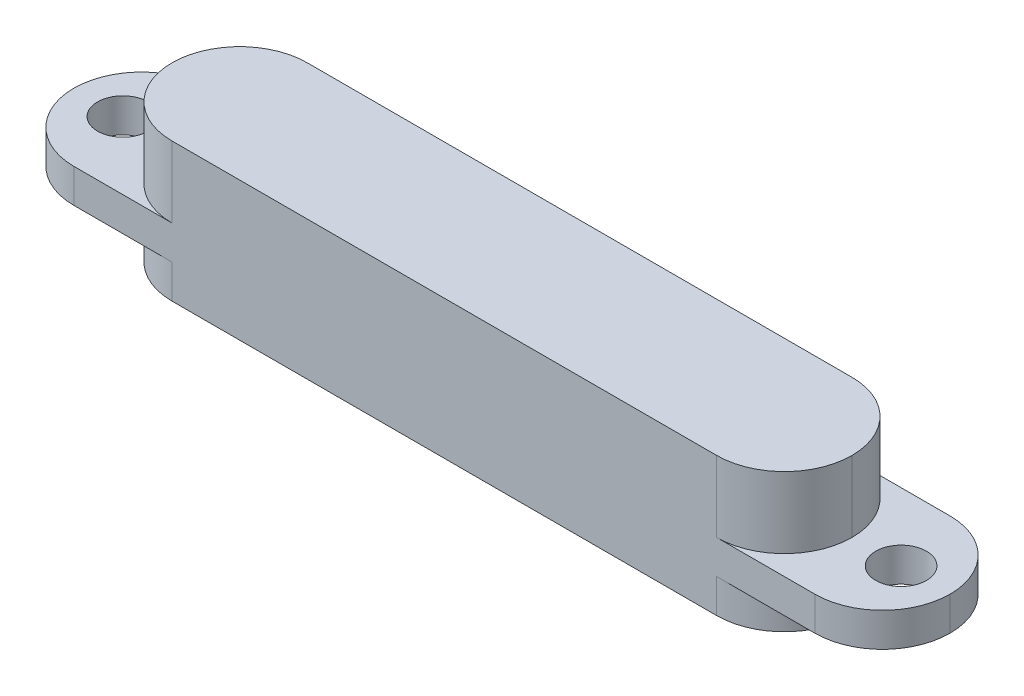
ISO-10303-21;
HEADER;
FILE_DESCRIPTION(('STEP AP214'),'2;1');
FILE_NAME('part.step','',(''),(''),'','','');
FILE_SCHEMA(('AUTOMOTIVE_DESIGN { 1 0 10303 214 1 1 1 1 }'));
ENDSEC;
DATA;
#1=APPLICATION_CONTEXT('core data for automotive mechanical design processes');
#2=APPLICATION_PROTOCOL_DEFINITION('international standard','automotive_design',2000,#1);
#3=PRODUCT_CONTEXT('',#1,'mechanical');
#4=PRODUCT('Part','Part','',(#3));
#5=PRODUCT_RELATED_PRODUCT_CATEGORY('part','',(#4));
#6=PRODUCT_DEFINITION_FORMATION('','',#4);
#7=PRODUCT_DEFINITION_CONTEXT('part definition',#1,'design');
#8=PRODUCT_DEFINITION('design','',#6,#7);
#9=PRODUCT_DEFINITION_SHAPE('','',#8);
#10=(LENGTH_UNIT() NAMED_UNIT(*) SI_UNIT(.MILLI.,.METRE.));
#11=(NAMED_UNIT(*) PLANE_ANGLE_UNIT() SI_UNIT($,.RADIAN.));
#12=(NAMED_UNIT(*) SI_UNIT($,.STERADIAN.) SOLID_ANGLE_UNIT());
#13=UNCERTAINTY_MEASURE_WITH_UNIT(LENGTH_MEASURE(1.E-05),#10,'distance_accuracy_value','');
#14=(GEOMETRIC_REPRESENTATION_CONTEXT(3) GLOBAL_UNCERTAINTY_ASSIGNED_CONTEXT((#13)) GLOBAL_UNIT_ASSIGNED_CONTEXT((#10,
#11,#12)) REPRESENTATION_CONTEXT('',''));
#15=CARTESIAN_POINT('',(0.,0.,0.));
#16=DIRECTION('',(0.,0.,1.));
#17=DIRECTION('',(1.,0.,0.));
#18=AXIS2_PLACEMENT_3D('',#15,#16,#17);
#19=CARTESIAN_POINT('',(0.,-1.,0.));
#20=DIRECTION('',(0.,1.,0.));
#21=DIRECTION('',(0.,0.,1.));
#22=AXIS2_PLACEMENT_3D('',#19,#20,#21);
#23=PLANE('',#22);
#24=CARTESIAN_POINT('',(-11.5,-1.,0.));
#25=DIRECTION('',(0.,-1.,0.));
#26=DIRECTION('',(0.,0.,-1.));
#27=AXIS2_PLACEMENT_3D('',#24,#25,#26);
#28=CIRCLE('',#27,0.75);
#29=CARTESIAN_POINT('',(-11.5,-1.,-0.75));
#30=VERTEX_POINT('',#29);
#31=EDGE_CURVE('E289',#30,#30,#28,.T.);
#32=ORIENTED_EDGE('',*,*,#31,.F.);
#33=EDGE_LOOP('',(#32));
#34=FACE_BOUND('',#33,.T.);
#35=DIRECTION('',(1.,0.,0.));
#36=VECTOR('',#35,1.);
#37=CARTESIAN_POINT('',(-12.95,-1.,2.));
#38=LINE('',#37,#36);
#39=CARTESIAN_POINT('',(-10.95,-1.,2.));
#40=VERTEX_POINT('',#39);
#41=CARTESIAN_POINT('',(-8.05,-1.,2.));
#42=VERTEX_POINT('',#41);
#43=EDGE_CURVE('E343',#40,#42,#38,.T.);
#44=ORIENTED_EDGE('',*,*,#43,.F.);
#45=CARTESIAN_POINT('',(-10.95,-1.,0.));
#46=DIRECTION('',(0.,1.,0.));
#47=DIRECTION('',(0.,0.,1.));
#48=AXIS2_PLACEMENT_3D('',#45,#46,#47);
#49=CIRCLE('',#48,2.);
#50=CARTESIAN_POINT('',(-12.95,-1.,0.));
#51=VERTEX_POINT('',#50);
#52=EDGE_CURVE('E190',#40,#51,#49,.F.);
#53=ORIENTED_EDGE('',*,*,#52,.T.);
#54=CARTESIAN_POINT('',(-10.95,-1.,0.));
#55=DIRECTION('',(0.,1.,0.));
#56=DIRECTION('',(0.,0.,1.));
#57=AXIS2_PLACEMENT_3D('',#54,#55,#56);
#58=CIRCLE('',#57,2.);
#59=CARTESIAN_POINT('',(-10.95,-1.,-2.));
#60=VERTEX_POINT('',#59);
#61=EDGE_CURVE('E175',#51,#60,#58,.F.);
#62=ORIENTED_EDGE('',*,*,#61,.T.);
#63=DIRECTION('',(1.,0.,0.));
#64=VECTOR('',#63,1.);
#65=CARTESIAN_POINT('',(-12.95,-1.,-2.));
#66=LINE('',#65,#64);
#67=CARTESIAN_POINT('',(-8.05,-1.,-2.));
#68=VERTEX_POINT('',#67);
#69=EDGE_CURVE('E334',#60,#68,#66,.T.);
#70=ORIENTED_EDGE('',*,*,#69,.T.);
#71=CARTESIAN_POINT('',(-8.05,-1.,0.));
#72=DIRECTION('',(0.,1.,0.));
#73=DIRECTION('',(0.,0.,1.));
#74=AXIS2_PLACEMENT_3D('',#71,#72,#73);
#75=CIRCLE('',#74,2.);
#76=CARTESIAN_POINT('',(-10.05,-1.,0.));
#77=VERTEX_POINT('',#76);
#78=EDGE_CURVE('E257',#68,#77,#75,.T.);
#79=ORIENTED_EDGE('',*,*,#78,.T.);
#80=CARTESIAN_POINT('',(-8.05,-1.,0.));
#81=DIRECTION('',(0.,1.,0.));
#82=DIRECTION('',(0.,0.,1.));
#83=AXIS2_PLACEMENT_3D('',#80,#81,#82);
#84=CIRCLE('',#83,2.);
#85=EDGE_CURVE('E259',#77,#42,#84,.T.);
#86=ORIENTED_EDGE('',*,*,#85,.T.);
#87=EDGE_LOOP('',(#44,#53,#62,#70,#79,#86));
#88=FACE_BOUND('',#87,.T.);
#89=ADVANCED_FACE('F39',(#34,#88),#23,.F.);
#90=CARTESIAN_POINT('',(-10.05,2.1,2.));
#91=DIRECTION('',(0.,0.,-1.));
#92=DIRECTION('',(-1.,0.,0.));
#93=AXIS2_PLACEMENT_3D('',#90,#91,#92);
#94=PLANE('',#93);
#95=ORIENTED_EDGE('',*,*,#43,.T.);
#96=DIRECTION('',(0.,1.,0.));
#97=VECTOR('',#96,1.);
#98=CARTESIAN_POINT('',(-8.05,2.1,2.));
#99=LINE('',#98,#97);
#100=CARTESIAN_POINT('',(-8.05,-2.,2.));
#101=VERTEX_POINT('',#100);
#102=EDGE_CURVE('E247',#42,#101,#99,.F.);
#103=ORIENTED_EDGE('',*,*,#102,.T.);
#104=DIRECTION('',(1.,0.,0.));
#105=VECTOR('',#104,1.);
#106=CARTESIAN_POINT('',(0.,-2.,2.));
#107=LINE('',#106,#105);
#108=CARTESIAN_POINT('',(8.05,-2.,2.));
#109=VERTEX_POINT('',#108);
#110=EDGE_CURVE('E322',#101,#109,#107,.T.);
#111=ORIENTED_EDGE('',*,*,#110,.T.);
#112=DIRECTION('',(0.,1.,0.));
#113=VECTOR('',#112,1.);
#114=CARTESIAN_POINT('',(8.05,-1.,2.));
#115=LINE('',#114,#113);
#116=CARTESIAN_POINT('',(8.04999999999999,-1.,2.));
#117=VERTEX_POINT('',#116);
#118=EDGE_CURVE('E244',#109,#117,#115,.T.);
#119=ORIENTED_EDGE('',*,*,#118,.T.);
#120=CARTESIAN_POINT('',(10.95,-1.,2.));
#121=VERTEX_POINT('',#120);
#122=EDGE_CURVE('E346',#117,#121,#38,.T.);
#123=ORIENTED_EDGE('',*,*,#122,.T.);
#124=DIRECTION('',(0.,1.,0.));
#125=VECTOR('',#124,1.);
#126=CARTESIAN_POINT('',(10.95,0.,2.));
#127=LINE('',#126,#125);
#128=CARTESIAN_POINT('',(10.95,0.,2.));
#129=VERTEX_POINT('',#128);
#130=EDGE_CURVE('E191',#121,#129,#127,.T.);
#131=ORIENTED_EDGE('',*,*,#130,.T.);
#132=DIRECTION('',(1.,0.,0.));
#133=VECTOR('',#132,1.);
#134=CARTESIAN_POINT('',(-12.95,0.,2.));
#135=LINE('',#134,#133);
#136=CARTESIAN_POINT('',(8.05,0.,2.));
#137=VERTEX_POINT('',#136);
#138=EDGE_CURVE('E187',#137,#129,#135,.T.);
#139=ORIENTED_EDGE('',*,*,#138,.F.);
#140=DIRECTION('',(0.,-1.,0.));
#141=VECTOR('',#140,1.);
#142=CARTESIAN_POINT('',(8.05,2.1,2.));
#143=LINE('',#142,#141);
#144=CARTESIAN_POINT('',(8.05,2.1,2.));
#145=VERTEX_POINT('',#144);
#146=EDGE_CURVE('E242',#137,#145,#143,.F.);
#147=ORIENTED_EDGE('',*,*,#146,.T.);
#148=DIRECTION('',(1.,0.,0.));
#149=VECTOR('',#148,1.);
#150=CARTESIAN_POINT('',(-10.05,2.1,2.));
#151=LINE('',#150,#149);
#152=CARTESIAN_POINT('',(-8.05,2.1,2.));
#153=VERTEX_POINT('',#152);
#154=EDGE_CURVE('E198',#153,#145,#151,.T.);
#155=ORIENTED_EDGE('',*,*,#154,.F.);
#156=DIRECTION('',(0.,-1.,0.));
#157=VECTOR('',#156,1.);
#158=CARTESIAN_POINT('',(-8.05,0.,2.));
#159=LINE('',#158,#157);
#160=CARTESIAN_POINT('',(-8.05,0.,2.));
#161=VERTEX_POINT('',#160);
#162=EDGE_CURVE('E185',#153,#161,#159,.T.);
#163=ORIENTED_EDGE('',*,*,#162,.T.);
#164=CARTESIAN_POINT('',(-10.95,0.,2.));
#165=VERTEX_POINT('',#164);
#166=EDGE_CURVE('E167',#165,#161,#135,.T.);
#167=ORIENTED_EDGE('',*,*,#166,.F.);
#168=DIRECTION('',(0.,1.,0.));
#169=VECTOR('',#168,1.);
#170=CARTESIAN_POINT('',(-10.95,2.1,2.));
#171=LINE('',#170,#169);
#172=EDGE_CURVE('E181',#165,#40,#171,.F.);
#173=ORIENTED_EDGE('',*,*,#172,.T.);
#174=EDGE_LOOP('',(#95,#103,#111,#119,#123,#131,#139,#147,#155,#163,#167,#173));
#175=FACE_BOUND('',#174,.T.);
#176=ADVANCED_FACE('F180',(#175),#94,.F.);
#177=CARTESIAN_POINT('',(-10.05,2.1,-2.));
#178=DIRECTION('',(0.,0.,-1.));
#179=DIRECTION('',(-1.,0.,0.));
#180=AXIS2_PLACEMENT_3D('',#177,#178,#179);
#181=PLANE('',#180);
#182=DIRECTION('',(1.,0.,0.));
#183=VECTOR('',#182,1.);
#184=CARTESIAN_POINT('',(0.,-2.,-2.));
#185=LINE('',#184,#183);
#186=CARTESIAN_POINT('',(-8.05,-2.,-2.));
#187=VERTEX_POINT('',#186);
#188=CARTESIAN_POINT('',(8.05,-2.,-2.));
#189=VERTEX_POINT('',#188);
#190=EDGE_CURVE('E220',#187,#189,#185,.T.);
#191=ORIENTED_EDGE('',*,*,#190,.F.);
#192=DIRECTION('',(0.,1.,0.));
#193=VECTOR('',#192,1.);
#194=CARTESIAN_POINT('',(-8.05,-1.,-2.));
#195=LINE('',#194,#193);
#196=EDGE_CURVE('E230',#187,#68,#195,.T.);
#197=ORIENTED_EDGE('',*,*,#196,.T.);
#198=ORIENTED_EDGE('',*,*,#69,.F.);
#199=DIRECTION('',(0.,1.,0.));
#200=VECTOR('',#199,1.);
#201=CARTESIAN_POINT('',(-10.95,0.,-2.));
#202=LINE('',#201,#200);
#203=CARTESIAN_POINT('',(-10.95,0.,-2.));
#204=VERTEX_POINT('',#203);
#205=EDGE_CURVE('E209',#60,#204,#202,.T.);
#206=ORIENTED_EDGE('',*,*,#205,.T.);
#207=DIRECTION('',(1.,0.,0.));
#208=VECTOR('',#207,1.);
#209=CARTESIAN_POINT('',(-12.95,0.,-2.));
#210=LINE('',#209,#208);
#211=CARTESIAN_POINT('',(-8.05,0.,-2.));
#212=VERTEX_POINT('',#211);
#213=EDGE_CURVE('E348',#204,#212,#210,.T.);
#214=ORIENTED_EDGE('',*,*,#213,.T.);
#215=DIRECTION('',(0.,-1.,0.));
#216=VECTOR('',#215,1.);
#217=CARTESIAN_POINT('',(-8.05,2.1,-2.));
#218=LINE('',#217,#216);
#219=CARTESIAN_POINT('',(-8.05,2.1,-2.));
#220=VERTEX_POINT('',#219);
#221=EDGE_CURVE('E216',#212,#220,#218,.F.);
#222=ORIENTED_EDGE('',*,*,#221,.T.);
#223=DIRECTION('',(1.,0.,0.));
#224=VECTOR('',#223,1.);
#225=CARTESIAN_POINT('',(-10.05,2.1,-2.));
#226=LINE('',#225,#224);
#227=CARTESIAN_POINT('',(8.05,2.1,-2.));
#228=VERTEX_POINT('',#227);
#229=EDGE_CURVE('E192',#220,#228,#226,.T.);
#230=ORIENTED_EDGE('',*,*,#229,.T.);
#231=DIRECTION('',(0.,-1.,0.));
#232=VECTOR('',#231,1.);
#233=CARTESIAN_POINT('',(8.05,0.,-2.));
#234=LINE('',#233,#232);
#235=CARTESIAN_POINT('',(8.04999999999999,0.,-2.));
#236=VERTEX_POINT('',#235);
#237=EDGE_CURVE('E225',#228,#236,#234,.T.);
#238=ORIENTED_EDGE('',*,*,#237,.T.);
#239=CARTESIAN_POINT('',(10.95,0.,-2.));
#240=VERTEX_POINT('',#239);
#241=EDGE_CURVE('E186',#236,#240,#210,.T.);
#242=ORIENTED_EDGE('',*,*,#241,.T.);
#243=DIRECTION('',(0.,1.,0.));
#244=VECTOR('',#243,1.);
#245=CARTESIAN_POINT('',(10.95,2.1,-2.));
#246=LINE('',#245,#244);
#247=CARTESIAN_POINT('',(10.95,-1.,-2.));
#248=VERTEX_POINT('',#247);
#249=EDGE_CURVE('E211',#240,#248,#246,.F.);
#250=ORIENTED_EDGE('',*,*,#249,.T.);
#251=CARTESIAN_POINT('',(8.05,-1.,-2.));
#252=VERTEX_POINT('',#251);
#253=EDGE_CURVE('E345',#252,#248,#66,.T.);
#254=ORIENTED_EDGE('',*,*,#253,.F.);
#255=DIRECTION('',(0.,1.,0.));
#256=VECTOR('',#255,1.);
#257=CARTESIAN_POINT('',(8.05,2.1,-2.));
#258=LINE('',#257,#256);
#259=EDGE_CURVE('E228',#252,#189,#258,.F.);
#260=ORIENTED_EDGE('',*,*,#259,.T.);
#261=EDGE_LOOP('',(#191,#197,#198,#206,#214,#222,#230,#238,#242,#250,#254,#260));
#262=FACE_BOUND('',#261,.T.);
#263=ADVANCED_FACE('F333',(#262),#181,.T.);
#264=CARTESIAN_POINT('',(0.,2.1,0.));
#265=DIRECTION('',(0.,1.,0.));
#266=DIRECTION('',(0.,0.,1.));
#267=AXIS2_PLACEMENT_3D('',#264,#265,#266);
#268=PLANE('',#267);
#269=CARTESIAN_POINT('',(8.05,2.1,0.));
#270=DIRECTION('',(0.,1.,0.));
#271=DIRECTION('',(0.,0.,1.));
#272=AXIS2_PLACEMENT_3D('',#269,#270,#271);
#273=CIRCLE('',#272,2.);
#274=CARTESIAN_POINT('',(10.05,2.1,0.));
#275=VERTEX_POINT('',#274);
#276=EDGE_CURVE('E253',#145,#275,#273,.T.);
#277=ORIENTED_EDGE('',*,*,#276,.T.);
#278=CARTESIAN_POINT('',(8.05,2.1,0.));
#279=DIRECTION('',(0.,1.,0.));
#280=DIRECTION('',(0.,0.,1.));
#281=AXIS2_PLACEMENT_3D('',#278,#279,#280);
#282=CIRCLE('',#281,2.);
#283=EDGE_CURVE('E255',#275,#228,#282,.T.);
#284=ORIENTED_EDGE('',*,*,#283,.T.);
#285=ORIENTED_EDGE('',*,*,#229,.F.);
#286=CARTESIAN_POINT('',(-8.05,2.1,0.));
#287=DIRECTION('',(0.,1.,0.));
#288=DIRECTION('',(0.,0.,1.));
#289=AXIS2_PLACEMENT_3D('',#286,#287,#288);
#290=CIRCLE('',#289,2.);
#291=CARTESIAN_POINT('',(-10.05,2.1,0.));
#292=VERTEX_POINT('',#291);
#293=EDGE_CURVE('E249',#220,#292,#290,.T.);
#294=ORIENTED_EDGE('',*,*,#293,.T.);
#295=CARTESIAN_POINT('',(-8.05,2.1,0.));
#296=DIRECTION('',(0.,1.,0.));
#297=DIRECTION('',(0.,0.,1.));
#298=AXIS2_PLACEMENT_3D('',#295,#296,#297);
#299=CIRCLE('',#298,2.);
#300=EDGE_CURVE('E251',#292,#153,#299,.T.);
#301=ORIENTED_EDGE('',*,*,#300,.T.);
#302=ORIENTED_EDGE('',*,*,#154,.T.);
#303=EDGE_LOOP('',(#277,#284,#285,#294,#301,#302));
#304=FACE_BOUND('',#303,.T.);
#305=ADVANCED_FACE('F352',(#304),#268,.T.);
#306=CARTESIAN_POINT('',(0.,0.,0.));
#307=DIRECTION('',(0.,1.,0.));
#308=DIRECTION('',(0.,0.,1.));
#309=AXIS2_PLACEMENT_3D('',#306,#307,#308);
#310=PLANE('',#309);
#311=CARTESIAN_POINT('',(11.5,0.,0.));
#312=DIRECTION('',(0.,1.,0.));
#313=DIRECTION('',(0.,0.,1.));
#314=AXIS2_PLACEMENT_3D('',#311,#312,#313);
#315=CIRCLE('',#314,0.75);
#316=CARTESIAN_POINT('',(11.5,0.,0.750000000000001));
#317=VERTEX_POINT('',#316);
#318=EDGE_CURVE('E285',#317,#317,#315,.T.);
#319=ORIENTED_EDGE('',*,*,#318,.F.);
#320=EDGE_LOOP('',(#319));
#321=FACE_BOUND('',#320,.T.);
#322=ORIENTED_EDGE('',*,*,#138,.T.);
#323=CARTESIAN_POINT('',(10.95,0.,0.));
#324=DIRECTION('',(0.,1.,0.));
#325=DIRECTION('',(0.,0.,1.));
#326=AXIS2_PLACEMENT_3D('',#323,#324,#325);
#327=CIRCLE('',#326,2.);
#328=CARTESIAN_POINT('',(12.95,0.,0.));
#329=VERTEX_POINT('',#328);
#330=EDGE_CURVE('E203',#129,#329,#327,.T.);
#331=ORIENTED_EDGE('',*,*,#330,.T.);
#332=CARTESIAN_POINT('',(10.95,0.,0.));
#333=DIRECTION('',(0.,1.,0.));
#334=DIRECTION('',(0.,0.,1.));
#335=AXIS2_PLACEMENT_3D('',#332,#333,#334);
#336=CIRCLE('',#335,2.);
#337=EDGE_CURVE('E195',#329,#240,#336,.T.);
#338=ORIENTED_EDGE('',*,*,#337,.T.);
#339=ORIENTED_EDGE('',*,*,#241,.F.);
#340=CARTESIAN_POINT('',(8.05,0.,0.));
#341=DIRECTION('',(0.,1.,0.));
#342=DIRECTION('',(0.,0.,1.));
#343=AXIS2_PLACEMENT_3D('',#340,#341,#342);
#344=CIRCLE('',#343,2.);
#345=CARTESIAN_POINT('',(10.05,0.,0.));
#346=VERTEX_POINT('',#345);
#347=EDGE_CURVE('E62',#236,#346,#344,.F.);
#348=ORIENTED_EDGE('',*,*,#347,.T.);
#349=CARTESIAN_POINT('',(8.05,0.,0.));
#350=DIRECTION('',(0.,1.,0.));
#351=DIRECTION('',(0.,0.,1.));
#352=AXIS2_PLACEMENT_3D('',#349,#350,#351);
#353=CIRCLE('',#352,2.);
#354=EDGE_CURVE('E268',#346,#137,#353,.F.);
#355=ORIENTED_EDGE('',*,*,#354,.T.);
#356=EDGE_LOOP('',(#322,#331,#338,#339,#348,#355));
#357=FACE_BOUND('',#356,.T.);
#358=ADVANCED_FACE('F392',(#321,#357),#310,.T.);
#359=CARTESIAN_POINT('',(11.5,-1.,0.));
#360=DIRECTION('',(0.,-1.,0.));
#361=DIRECTION('',(0.,0.,-1.));
#362=AXIS2_PLACEMENT_3D('',#359,#360,#361);
#363=CIRCLE('',#362,0.75);
#364=CARTESIAN_POINT('',(11.5,-1.,-0.75));
#365=VERTEX_POINT('',#364);
#366=EDGE_CURVE('E403',#365,#365,#363,.T.);
#367=ORIENTED_EDGE('',*,*,#366,.F.);
#368=EDGE_LOOP('',(#367));
#369=FACE_BOUND('',#368,.T.);
#370=CARTESIAN_POINT('',(10.95,-1.,0.));
#371=DIRECTION('',(0.,1.,0.));
#372=DIRECTION('',(0.,0.,1.));
#373=AXIS2_PLACEMENT_3D('',#370,#371,#372);
#374=CIRCLE('',#373,2.);
#375=CARTESIAN_POINT('',(12.95,-1.,0.));
#376=VERTEX_POINT('',#375);
#377=EDGE_CURVE('E205',#248,#376,#374,.F.);
#378=ORIENTED_EDGE('',*,*,#377,.T.);
#379=CARTESIAN_POINT('',(10.95,-1.,0.));
#380=DIRECTION('',(0.,1.,0.));
#381=DIRECTION('',(0.,0.,1.));
#382=AXIS2_PLACEMENT_3D('',#379,#380,#381);
#383=CIRCLE('',#382,2.);
#384=EDGE_CURVE('E207',#376,#121,#383,.F.);
#385=ORIENTED_EDGE('',*,*,#384,.T.);
#386=ORIENTED_EDGE('',*,*,#122,.F.);
#387=CARTESIAN_POINT('',(8.05,-1.,0.));
#388=DIRECTION('',(0.,1.,0.));
#389=DIRECTION('',(0.,0.,1.));
#390=AXIS2_PLACEMENT_3D('',#387,#388,#389);
#391=CIRCLE('',#390,2.);
#392=CARTESIAN_POINT('',(10.05,-1.,0.));
#393=VERTEX_POINT('',#392);
#394=EDGE_CURVE('E262',#117,#393,#391,.T.);
#395=ORIENTED_EDGE('',*,*,#394,.T.);
#396=CARTESIAN_POINT('',(8.05,-1.,0.));
#397=DIRECTION('',(0.,1.,0.));
#398=DIRECTION('',(0.,0.,1.));
#399=AXIS2_PLACEMENT_3D('',#396,#397,#398);
#400=CIRCLE('',#399,2.);
#401=EDGE_CURVE('E264',#393,#252,#400,.T.);
#402=ORIENTED_EDGE('',*,*,#401,.T.);
#403=ORIENTED_EDGE('',*,*,#253,.T.);
#404=EDGE_LOOP('',(#378,#385,#386,#395,#402,#403));
#405=FACE_BOUND('',#404,.T.);
#406=ADVANCED_FACE('F383',(#369,#405),#23,.F.);
#407=CARTESIAN_POINT('',(-11.5,0.,0.));
#408=DIRECTION('',(0.,1.,0.));
#409=DIRECTION('',(0.,0.,1.));
#410=AXIS2_PLACEMENT_3D('',#407,#408,#409);
#411=CIRCLE('',#410,0.75);
#412=CARTESIAN_POINT('',(-11.5,0.,0.75));
#413=VERTEX_POINT('',#412);
#414=EDGE_CURVE('E286',#413,#413,#411,.T.);
#415=ORIENTED_EDGE('',*,*,#414,.F.);
#416=EDGE_LOOP('',(#415));
#417=FACE_BOUND('',#416,.T.);
#418=CARTESIAN_POINT('',(-10.95,0.,0.));
#419=DIRECTION('',(0.,1.,0.));
#420=DIRECTION('',(0.,0.,1.));
#421=AXIS2_PLACEMENT_3D('',#418,#419,#420);
#422=CIRCLE('',#421,2.);
#423=CARTESIAN_POINT('',(-12.95,0.,0.));
#424=VERTEX_POINT('',#423);
#425=EDGE_CURVE('E170',#204,#424,#422,.T.);
#426=ORIENTED_EDGE('',*,*,#425,.T.);
#427=CARTESIAN_POINT('',(-10.95,0.,0.));
#428=DIRECTION('',(0.,1.,0.));
#429=DIRECTION('',(0.,0.,1.));
#430=AXIS2_PLACEMENT_3D('',#427,#428,#429);
#431=CIRCLE('',#430,2.);
#432=EDGE_CURVE('E164',#424,#165,#431,.T.);
#433=ORIENTED_EDGE('',*,*,#432,.T.);
#434=ORIENTED_EDGE('',*,*,#166,.T.);
#435=CARTESIAN_POINT('',(-8.05,0.,0.));
#436=DIRECTION('',(0.,1.,0.));
#437=DIRECTION('',(0.,0.,1.));
#438=AXIS2_PLACEMENT_3D('',#435,#436,#437);
#439=CIRCLE('',#438,2.);
#440=CARTESIAN_POINT('',(-10.05,0.,0.));
#441=VERTEX_POINT('',#440);
#442=EDGE_CURVE('E54',#161,#441,#439,.F.);
#443=ORIENTED_EDGE('',*,*,#442,.T.);
#444=CARTESIAN_POINT('',(-8.05,0.,0.));
#445=DIRECTION('',(0.,1.,0.));
#446=DIRECTION('',(0.,0.,1.));
#447=AXIS2_PLACEMENT_3D('',#444,#445,#446);
#448=CIRCLE('',#447,2.);
#449=EDGE_CURVE('E271',#441,#212,#448,.F.);
#450=ORIENTED_EDGE('',*,*,#449,.T.);
#451=ORIENTED_EDGE('',*,*,#213,.F.);
#452=EDGE_LOOP('',(#426,#433,#434,#443,#450,#451));
#453=FACE_BOUND('',#452,.T.);
#454=ADVANCED_FACE('F166',(#417,#453),#310,.T.);
#455=CARTESIAN_POINT('',(0.,-2.,0.));
#456=DIRECTION('',(0.,-1.,0.));
#457=DIRECTION('',(0.,0.,-1.));
#458=AXIS2_PLACEMENT_3D('',#455,#456,#457);
#459=PLANE('',#458);
#460=CARTESIAN_POINT('',(5.08,-2.,0.));
#461=DIRECTION('',(0.,-1.,0.));
#462=DIRECTION('',(0.,0.,-1.));
#463=AXIS2_PLACEMENT_3D('',#460,#461,#462);
#464=CIRCLE('',#463,0.500000000000001);
#465=CARTESIAN_POINT('',(5.08,-2.,-0.500000000000001));
#466=VERTEX_POINT('',#465);
#467=EDGE_CURVE('E11',#466,#466,#464,.T.);
#468=ORIENTED_EDGE('',*,*,#467,.F.);
#469=EDGE_LOOP('',(#468));
#470=FACE_BOUND('',#469,.T.);
#471=CARTESIAN_POINT('',(2.54,-2.,0.));
#472=DIRECTION('',(0.,-1.,0.));
#473=DIRECTION('',(0.,0.,-1.));
#474=AXIS2_PLACEMENT_3D('',#471,#472,#473);
#475=CIRCLE('',#474,0.5);
#476=CARTESIAN_POINT('',(2.54,-2.,-0.5));
#477=VERTEX_POINT('',#476);
#478=EDGE_CURVE('E47',#477,#477,#475,.T.);
#479=ORIENTED_EDGE('',*,*,#478,.F.);
#480=EDGE_LOOP('',(#479));
#481=FACE_BOUND('',#480,.T.);
#482=CARTESIAN_POINT('',(0.,-2.,0.));
#483=DIRECTION('',(0.,-1.,0.));
#484=DIRECTION('',(0.,0.,-1.));
#485=AXIS2_PLACEMENT_3D('',#482,#483,#484);
#486=CIRCLE('',#485,0.5);
#487=CARTESIAN_POINT('',(0.,-2.,-0.5));
#488=VERTEX_POINT('',#487);
#489=EDGE_CURVE('E295',#488,#488,#486,.T.);
#490=ORIENTED_EDGE('',*,*,#489,.F.);
#491=EDGE_LOOP('',(#490));
#492=FACE_BOUND('',#491,.T.);
#493=CARTESIAN_POINT('',(-5.08,-2.,0.));
#494=DIRECTION('',(0.,-1.,0.));
#495=DIRECTION('',(0.,0.,-1.));
#496=AXIS2_PLACEMENT_3D('',#493,#494,#495);
#497=CIRCLE('',#496,0.500000000000001);
#498=CARTESIAN_POINT('',(-5.08,-2.,-0.500000000000001));
#499=VERTEX_POINT('',#498);
#500=EDGE_CURVE('E292',#499,#499,#497,.T.);
#501=ORIENTED_EDGE('',*,*,#500,.F.);
#502=EDGE_LOOP('',(#501));
#503=FACE_BOUND('',#502,.T.);
#504=CARTESIAN_POINT('',(-2.54,-2.,0.));
#505=DIRECTION('',(0.,-1.,0.));
#506=DIRECTION('',(0.,0.,-1.));
#507=AXIS2_PLACEMENT_3D('',#504,#505,#506);
#508=CIRCLE('',#507,0.5);
#509=CARTESIAN_POINT('',(-2.54,-2.,-0.5));
#510=VERTEX_POINT('',#509);
#511=EDGE_CURVE('E273',#510,#510,#508,.T.);
#512=ORIENTED_EDGE('',*,*,#511,.F.);
#513=EDGE_LOOP('',(#512));
#514=FACE_BOUND('',#513,.T.);
#515=CARTESIAN_POINT('',(-8.05,-2.,0.));
#516=DIRECTION('',(0.,-1.,0.));
#517=DIRECTION('',(0.,0.,-1.));
#518=AXIS2_PLACEMENT_3D('',#515,#516,#517);
#519=CIRCLE('',#518,2.);
#520=CARTESIAN_POINT('',(-10.05,-2.,0.));
#521=VERTEX_POINT('',#520);
#522=EDGE_CURVE('E237',#101,#521,#519,.T.);
#523=ORIENTED_EDGE('',*,*,#522,.T.);
#524=CARTESIAN_POINT('',(-8.05,-2.,0.));
#525=DIRECTION('',(0.,-1.,0.));
#526=DIRECTION('',(0.,0.,-1.));
#527=AXIS2_PLACEMENT_3D('',#524,#525,#526);
#528=CIRCLE('',#527,2.);
#529=EDGE_CURVE('E239',#521,#187,#528,.T.);
#530=ORIENTED_EDGE('',*,*,#529,.T.);
#531=ORIENTED_EDGE('',*,*,#190,.T.);
#532=CARTESIAN_POINT('',(8.05,-2.,0.));
#533=DIRECTION('',(0.,-1.,0.));
#534=DIRECTION('',(0.,0.,-1.));
#535=AXIS2_PLACEMENT_3D('',#532,#533,#534);
#536=CIRCLE('',#535,2.);
#537=CARTESIAN_POINT('',(10.05,-2.,0.));
#538=VERTEX_POINT('',#537);
#539=EDGE_CURVE('E233',#189,#538,#536,.T.);
#540=ORIENTED_EDGE('',*,*,#539,.T.);
#541=CARTESIAN_POINT('',(8.05,-2.,0.));
#542=DIRECTION('',(0.,-1.,0.));
#543=DIRECTION('',(0.,0.,-1.));
#544=AXIS2_PLACEMENT_3D('',#541,#542,#543);
#545=CIRCLE('',#544,2.);
#546=EDGE_CURVE('E235',#538,#109,#545,.T.);
#547=ORIENTED_EDGE('',*,*,#546,.T.);
#548=ORIENTED_EDGE('',*,*,#110,.F.);
#549=EDGE_LOOP('',(#523,#530,#531,#540,#547,#548));
#550=FACE_BOUND('',#549,.T.);
#551=ADVANCED_FACE('F303',(#470,#481,#492,#503,#514,#550),#459,.T.);
#552=CARTESIAN_POINT('',(10.95,-1.,0.));
#553=DIRECTION('',(0.,1.,0.));
#554=DIRECTION('',(0.,0.,1.));
#555=AXIS2_PLACEMENT_3D('',#552,#553,#554);
#556=CYLINDRICAL_SURFACE('',#555,2.);
#557=DIRECTION('',(0.,1.,0.));
#558=VECTOR('',#557,1.);
#559=CARTESIAN_POINT('',(12.95,-1.,0.));
#560=LINE('',#559,#558);
#561=EDGE_CURVE('E217',#376,#329,#560,.T.);
#562=ORIENTED_EDGE('',*,*,#561,.F.);
#563=ORIENTED_EDGE('',*,*,#377,.F.);
#564=ORIENTED_EDGE('',*,*,#249,.F.);
#565=ORIENTED_EDGE('',*,*,#337,.F.);
#566=EDGE_LOOP('',(#562,#563,#564,#565));
#567=FACE_BOUND('',#566,.T.);
#568=ADVANCED_FACE('F306',(#567),#556,.T.);
#569=CARTESIAN_POINT('',(10.95,2.1,0.));
#570=DIRECTION('',(0.,-1.,0.));
#571=DIRECTION('',(0.,0.,-1.));
#572=AXIS2_PLACEMENT_3D('',#569,#570,#571);
#573=CYLINDRICAL_SURFACE('',#572,2.);
#574=ORIENTED_EDGE('',*,*,#384,.F.);
#575=ORIENTED_EDGE('',*,*,#561,.T.);
#576=ORIENTED_EDGE('',*,*,#330,.F.);
#577=ORIENTED_EDGE('',*,*,#130,.F.);
#578=EDGE_LOOP('',(#574,#575,#576,#577));
#579=FACE_BOUND('',#578,.T.);
#580=ADVANCED_FACE('F414',(#579),#573,.T.);
#581=CARTESIAN_POINT('',(-10.95,2.1,0.));
#582=DIRECTION('',(0.,-1.,0.));
#583=DIRECTION('',(0.,0.,-1.));
#584=AXIS2_PLACEMENT_3D('',#581,#582,#583);
#585=CYLINDRICAL_SURFACE('',#584,2.);
#586=ORIENTED_EDGE('',*,*,#205,.F.);
#587=ORIENTED_EDGE('',*,*,#61,.F.);
#588=DIRECTION('',(0.,1.,0.));
#589=VECTOR('',#588,1.);
#590=CARTESIAN_POINT('',(-12.95,-1.,0.));
#591=LINE('',#590,#589);
#592=EDGE_CURVE('E221',#424,#51,#591,.F.);
#593=ORIENTED_EDGE('',*,*,#592,.F.);
#594=ORIENTED_EDGE('',*,*,#425,.F.);
#595=EDGE_LOOP('',(#586,#587,#593,#594));
#596=FACE_BOUND('',#595,.T.);
#597=ADVANCED_FACE('F680',(#596),#585,.T.);
#598=CARTESIAN_POINT('',(-10.95,-1.,0.));
#599=DIRECTION('',(0.,1.,0.));
#600=DIRECTION('',(0.,0.,1.));
#601=AXIS2_PLACEMENT_3D('',#598,#599,#600);
#602=CYLINDRICAL_SURFACE('',#601,2.);
#603=ORIENTED_EDGE('',*,*,#52,.F.);
#604=ORIENTED_EDGE('',*,*,#172,.F.);
#605=ORIENTED_EDGE('',*,*,#432,.F.);
#606=ORIENTED_EDGE('',*,*,#592,.T.);
#607=EDGE_LOOP('',(#603,#604,#605,#606));
#608=FACE_BOUND('',#607,.T.);
#609=ADVANCED_FACE('F189',(#608),#602,.T.);
#610=CARTESIAN_POINT('',(-8.05,-2.,0.));
#611=DIRECTION('',(0.,1.,0.));
#612=DIRECTION('',(0.,0.,1.));
#613=AXIS2_PLACEMENT_3D('',#610,#611,#612);
#614=CYLINDRICAL_SURFACE('',#613,2.);
#615=DIRECTION('',(0.,1.,0.));
#616=VECTOR('',#615,1.);
#617=CARTESIAN_POINT('',(-10.05,-2.,0.));
#618=LINE('',#617,#616);
#619=EDGE_CURVE('E223',#521,#77,#618,.T.);
#620=ORIENTED_EDGE('',*,*,#619,.F.);
#621=ORIENTED_EDGE('',*,*,#522,.F.);
#622=ORIENTED_EDGE('',*,*,#102,.F.);
#623=ORIENTED_EDGE('',*,*,#85,.F.);
#624=EDGE_LOOP('',(#620,#621,#622,#623));
#625=FACE_BOUND('',#624,.T.);
#626=ADVANCED_FACE('F326',(#625),#614,.T.);
#627=CARTESIAN_POINT('',(-8.05,2.1,0.));
#628=DIRECTION('',(0.,-1.,0.));
#629=DIRECTION('',(0.,0.,-1.));
#630=AXIS2_PLACEMENT_3D('',#627,#628,#629);
#631=CYLINDRICAL_SURFACE('',#630,2.);
#632=ORIENTED_EDGE('',*,*,#529,.F.);
#633=ORIENTED_EDGE('',*,*,#619,.T.);
#634=ORIENTED_EDGE('',*,*,#78,.F.);
#635=ORIENTED_EDGE('',*,*,#196,.F.);
#636=EDGE_LOOP('',(#632,#633,#634,#635));
#637=FACE_BOUND('',#636,.T.);
#638=ADVANCED_FACE('F330',(#637),#631,.T.);
#639=CARTESIAN_POINT('',(8.05,-2.,0.));
#640=DIRECTION('',(0.,1.,0.));
#641=DIRECTION('',(0.,0.,1.));
#642=AXIS2_PLACEMENT_3D('',#639,#640,#641);
#643=CYLINDRICAL_SURFACE('',#642,2.);
#644=DIRECTION('',(0.,1.,0.));
#645=VECTOR('',#644,1.);
#646=CARTESIAN_POINT('',(10.05,-2.,0.));
#647=LINE('',#646,#645);
#648=EDGE_CURVE('E276',#538,#393,#647,.T.);
#649=ORIENTED_EDGE('',*,*,#648,.F.);
#650=ORIENTED_EDGE('',*,*,#539,.F.);
#651=ORIENTED_EDGE('',*,*,#259,.F.);
#652=ORIENTED_EDGE('',*,*,#401,.F.);
#653=EDGE_LOOP('',(#649,#650,#651,#652));
#654=FACE_BOUND('',#653,.T.);
#655=ADVANCED_FACE('F420',(#654),#643,.T.);
#656=CARTESIAN_POINT('',(8.05,2.1,0.));
#657=DIRECTION('',(0.,-1.,0.));
#658=DIRECTION('',(0.,0.,-1.));
#659=AXIS2_PLACEMENT_3D('',#656,#657,#658);
#660=CYLINDRICAL_SURFACE('',#659,2.);
#661=ORIENTED_EDGE('',*,*,#546,.F.);
#662=ORIENTED_EDGE('',*,*,#648,.T.);
#663=ORIENTED_EDGE('',*,*,#394,.F.);
#664=ORIENTED_EDGE('',*,*,#118,.F.);
#665=EDGE_LOOP('',(#661,#662,#663,#664));
#666=FACE_BOUND('',#665,.T.);
#667=ADVANCED_FACE('F424',(#666),#660,.T.);
#668=CARTESIAN_POINT('',(8.05,2.1,0.));
#669=DIRECTION('',(0.,-1.,0.));
#670=DIRECTION('',(0.,0.,-1.));
#671=AXIS2_PLACEMENT_3D('',#668,#669,#670);
#672=CYLINDRICAL_SURFACE('',#671,2.);
#673=DIRECTION('',(0.,-1.,0.));
#674=VECTOR('',#673,1.);
#675=CARTESIAN_POINT('',(10.05,2.1,0.));
#676=LINE('',#675,#674);
#677=EDGE_CURVE('E279',#275,#346,#676,.T.);
#678=ORIENTED_EDGE('',*,*,#677,.F.);
#679=ORIENTED_EDGE('',*,*,#276,.F.);
#680=ORIENTED_EDGE('',*,*,#146,.F.);
#681=ORIENTED_EDGE('',*,*,#354,.F.);
#682=EDGE_LOOP('',(#678,#679,#680,#681));
#683=FACE_BOUND('',#682,.T.);
#684=ADVANCED_FACE('F357',(#683),#672,.T.);
#685=CARTESIAN_POINT('',(8.05,2.1,0.));
#686=DIRECTION('',(0.,1.,0.));
#687=DIRECTION('',(0.,0.,1.));
#688=AXIS2_PLACEMENT_3D('',#685,#686,#687);
#689=CYLINDRICAL_SURFACE('',#688,2.);
#690=ORIENTED_EDGE('',*,*,#283,.F.);
#691=ORIENTED_EDGE('',*,*,#677,.T.);
#692=ORIENTED_EDGE('',*,*,#347,.F.);
#693=ORIENTED_EDGE('',*,*,#237,.F.);
#694=EDGE_LOOP('',(#690,#691,#692,#693));
#695=FACE_BOUND('',#694,.T.);
#696=ADVANCED_FACE('F361',(#695),#689,.T.);
#697=CARTESIAN_POINT('',(-8.05,2.1,0.));
#698=DIRECTION('',(0.,-1.,0.));
#699=DIRECTION('',(0.,0.,-1.));
#700=AXIS2_PLACEMENT_3D('',#697,#698,#699);
#701=CYLINDRICAL_SURFACE('',#700,2.);
#702=DIRECTION('',(0.,-1.,0.));
#703=VECTOR('',#702,1.);
#704=CARTESIAN_POINT('',(-10.05,2.1,0.));
#705=LINE('',#704,#703);
#706=EDGE_CURVE('E282',#292,#441,#705,.T.);
#707=ORIENTED_EDGE('',*,*,#706,.F.);
#708=ORIENTED_EDGE('',*,*,#293,.F.);
#709=ORIENTED_EDGE('',*,*,#221,.F.);
#710=ORIENTED_EDGE('',*,*,#449,.F.);
#711=EDGE_LOOP('',(#707,#708,#709,#710));
#712=FACE_BOUND('',#711,.T.);
#713=ADVANCED_FACE('F41',(#712),#701,.T.);
#714=CARTESIAN_POINT('',(-8.05,2.1,0.));
#715=DIRECTION('',(0.,1.,0.));
#716=DIRECTION('',(0.,0.,1.));
#717=AXIS2_PLACEMENT_3D('',#714,#715,#716);
#718=CYLINDRICAL_SURFACE('',#717,2.);
#719=ORIENTED_EDGE('',*,*,#300,.F.);
#720=ORIENTED_EDGE('',*,*,#706,.T.);
#721=ORIENTED_EDGE('',*,*,#442,.F.);
#722=ORIENTED_EDGE('',*,*,#162,.F.);
#723=EDGE_LOOP('',(#719,#720,#721,#722));
#724=FACE_BOUND('',#723,.T.);
#725=ADVANCED_FACE('F369',(#724),#718,.T.);
#726=CARTESIAN_POINT('',(-11.5,2.1,0.));
#727=DIRECTION('',(0.,-1.,0.));
#728=DIRECTION('',(0.,0.,-1.));
#729=AXIS2_PLACEMENT_3D('',#726,#727,#728);
#730=CYLINDRICAL_SURFACE('',#729,0.75);
#731=ORIENTED_EDGE('',*,*,#414,.T.);
#732=EDGE_LOOP('',(#731));
#733=FACE_BOUND('',#732,.T.);
#734=ORIENTED_EDGE('',*,*,#31,.T.);
#735=EDGE_LOOP('',(#734));
#736=FACE_BOUND('',#735,.T.);
#737=ADVANCED_FACE('F371',(#733,#736),#730,.F.);
#738=CARTESIAN_POINT('',(11.5,2.1,0.));
#739=DIRECTION('',(0.,-1.,0.));
#740=DIRECTION('',(0.,0.,-1.));
#741=AXIS2_PLACEMENT_3D('',#738,#739,#740);
#742=CYLINDRICAL_SURFACE('',#741,0.75);
#743=ORIENTED_EDGE('',*,*,#318,.T.);
#744=EDGE_LOOP('',(#743));
#745=FACE_BOUND('',#744,.T.);
#746=ORIENTED_EDGE('',*,*,#366,.T.);
#747=EDGE_LOOP('',(#746));
#748=FACE_BOUND('',#747,.T.);
#749=ADVANCED_FACE('F376',(#745,#748),#742,.F.);
#750=CARTESIAN_POINT('',(-2.54,-3.5,0.));
#751=DIRECTION('',(0.,1.,0.));
#752=DIRECTION('',(0.,0.,1.));
#753=AXIS2_PLACEMENT_3D('',#750,#751,#752);
#754=CYLINDRICAL_SURFACE('',#753,0.5);
#755=ORIENTED_EDGE('',*,*,#511,.T.);
#756=EDGE_LOOP('',(#755));
#757=FACE_BOUND('',#756,.T.);
#758=CARTESIAN_POINT('',(-2.54,-3.5,0.));
#759=DIRECTION('',(0.,1.,0.));
#760=DIRECTION('',(0.,0.,1.));
#761=AXIS2_PLACEMENT_3D('',#758,#759,#760);
#762=CIRCLE('',#761,0.5);
#763=CARTESIAN_POINT('',(-2.54,-3.5,0.5));
#764=VERTEX_POINT('',#763);
#765=EDGE_CURVE('E769',#764,#764,#762,.T.);
#766=ORIENTED_EDGE('',*,*,#765,.T.);
#767=EDGE_LOOP('',(#766));
#768=FACE_BOUND('',#767,.T.);
#769=ADVANCED_FACE('F493',(#757,#768),#754,.T.);
#770=CARTESIAN_POINT('',(-2.54,-3.5,0.));
#771=DIRECTION('',(0.,1.,0.));
#772=DIRECTION('',(0.,0.,1.));
#773=AXIS2_PLACEMENT_3D('',#770,#771,#772);
#774=PLANE('',#773);
#775=ORIENTED_EDGE('',*,*,#765,.F.);
#776=EDGE_LOOP('',(#775));
#777=FACE_BOUND('',#776,.T.);
#778=ADVANCED_FACE('F525',(#777),#774,.F.);
#779=CARTESIAN_POINT('',(-5.08,-3.5,0.));
#780=DIRECTION('',(0.,1.,0.));
#781=DIRECTION('',(0.,0.,1.));
#782=AXIS2_PLACEMENT_3D('',#779,#780,#781);
#783=CYLINDRICAL_SURFACE('',#782,0.500000000000001);
#784=ORIENTED_EDGE('',*,*,#500,.T.);
#785=EDGE_LOOP('',(#784));
#786=FACE_BOUND('',#785,.T.);
#787=CARTESIAN_POINT('',(-5.08,-3.5,0.));
#788=DIRECTION('',(0.,1.,0.));
#789=DIRECTION('',(0.,0.,1.));
#790=AXIS2_PLACEMENT_3D('',#787,#788,#789);
#791=CIRCLE('',#790,0.500000000000001);
#792=CARTESIAN_POINT('',(-5.08,-3.5,0.500000000000001));
#793=VERTEX_POINT('',#792);
#794=EDGE_CURVE('E766',#793,#793,#791,.T.);
#795=ORIENTED_EDGE('',*,*,#794,.T.);
#796=EDGE_LOOP('',(#795));
#797=FACE_BOUND('',#796,.T.);
#798=ADVANCED_FACE('F536',(#786,#797),#783,.T.);
#799=CARTESIAN_POINT('',(-5.08,-3.5,0.));
#800=DIRECTION('',(0.,1.,0.));
#801=DIRECTION('',(0.,0.,1.));
#802=AXIS2_PLACEMENT_3D('',#799,#800,#801);
#803=PLANE('',#802);
#804=ORIENTED_EDGE('',*,*,#794,.F.);
#805=EDGE_LOOP('',(#804));
#806=FACE_BOUND('',#805,.T.);
#807=ADVANCED_FACE('F547',(#806),#803,.F.);
#808=CARTESIAN_POINT('',(0.,-3.5,0.));
#809=DIRECTION('',(0.,1.,0.));
#810=DIRECTION('',(0.,0.,1.));
#811=AXIS2_PLACEMENT_3D('',#808,#809,#810);
#812=CYLINDRICAL_SURFACE('',#811,0.5);
#813=ORIENTED_EDGE('',*,*,#489,.T.);
#814=EDGE_LOOP('',(#813));
#815=FACE_BOUND('',#814,.T.);
#816=CARTESIAN_POINT('',(0.,-3.5,0.));
#817=DIRECTION('',(0.,1.,0.));
#818=DIRECTION('',(0.,0.,1.));
#819=AXIS2_PLACEMENT_3D('',#816,#817,#818);
#820=CIRCLE('',#819,0.5);
#821=CARTESIAN_POINT('',(0.,-3.5,0.5));
#822=VERTEX_POINT('',#821);
#823=EDGE_CURVE('E761',#822,#822,#820,.T.);
#824=ORIENTED_EDGE('',*,*,#823,.T.);
#825=EDGE_LOOP('',(#824));
#826=FACE_BOUND('',#825,.T.);
#827=ADVANCED_FACE('F558',(#815,#826),#812,.T.);
#828=CARTESIAN_POINT('',(0.,-3.5,0.));
#829=DIRECTION('',(0.,1.,0.));
#830=DIRECTION('',(0.,0.,1.));
#831=AXIS2_PLACEMENT_3D('',#828,#829,#830);
#832=PLANE('',#831);
#833=ORIENTED_EDGE('',*,*,#823,.F.);
#834=EDGE_LOOP('',(#833));
#835=FACE_BOUND('',#834,.T.);
#836=ADVANCED_FACE('F569',(#835),#832,.F.);
#837=CARTESIAN_POINT('',(2.54,-3.5,0.));
#838=DIRECTION('',(0.,1.,0.));
#839=DIRECTION('',(0.,0.,1.));
#840=AXIS2_PLACEMENT_3D('',#837,#838,#839);
#841=CYLINDRICAL_SURFACE('',#840,0.5);
#842=ORIENTED_EDGE('',*,*,#478,.T.);
#843=EDGE_LOOP('',(#842));
#844=FACE_BOUND('',#843,.T.);
#845=CARTESIAN_POINT('',(2.54,-3.5,0.));
#846=DIRECTION('',(0.,1.,0.));
#847=DIRECTION('',(0.,0.,1.));
#848=AXIS2_PLACEMENT_3D('',#845,#846,#847);
#849=CIRCLE('',#848,0.5);
#850=CARTESIAN_POINT('',(2.54,-3.5,0.5));
#851=VERTEX_POINT('',#850);
#852=EDGE_CURVE('E758',#851,#851,#849,.T.);
#853=ORIENTED_EDGE('',*,*,#852,.T.);
#854=EDGE_LOOP('',(#853));
#855=FACE_BOUND('',#854,.T.);
#856=ADVANCED_FACE('F300',(#844,#855),#841,.T.);
#857=CARTESIAN_POINT('',(2.54,-3.5,0.));
#858=DIRECTION('',(0.,1.,0.));
#859=DIRECTION('',(0.,0.,1.));
#860=AXIS2_PLACEMENT_3D('',#857,#858,#859);
#861=PLANE('',#860);
#862=ORIENTED_EDGE('',*,*,#852,.F.);
#863=EDGE_LOOP('',(#862));
#864=FACE_BOUND('',#863,.T.);
#865=ADVANCED_FACE('F590',(#864),#861,.F.);
#866=CARTESIAN_POINT('',(5.08,-3.5,0.));
#867=DIRECTION('',(0.,1.,0.));
#868=DIRECTION('',(0.,0.,1.));
#869=AXIS2_PLACEMENT_3D('',#866,#867,#868);
#870=CYLINDRICAL_SURFACE('',#869,0.500000000000001);
#871=ORIENTED_EDGE('',*,*,#467,.T.);
#872=EDGE_LOOP('',(#871));
#873=FACE_BOUND('',#872,.T.);
#874=CARTESIAN_POINT('',(5.08,-3.5,0.));
#875=DIRECTION('',(0.,1.,0.));
#876=DIRECTION('',(0.,0.,1.));
#877=AXIS2_PLACEMENT_3D('',#874,#875,#876);
#878=CIRCLE('',#877,0.500000000000001);
#879=CARTESIAN_POINT('',(5.08,-3.5,0.500000000000001));
#880=VERTEX_POINT('',#879);
#881=EDGE_CURVE('E756',#880,#880,#878,.T.);
#882=ORIENTED_EDGE('',*,*,#881,.T.);
#883=EDGE_LOOP('',(#882));
#884=FACE_BOUND('',#883,.T.);
#885=ADVANCED_FACE('F600',(#873,#884),#870,.T.);
#886=CARTESIAN_POINT('',(5.08,-3.5,0.));
#887=DIRECTION('',(0.,1.,0.));
#888=DIRECTION('',(0.,0.,1.));
#889=AXIS2_PLACEMENT_3D('',#886,#887,#888);
#890=PLANE('',#889);
#891=ORIENTED_EDGE('',*,*,#881,.F.);
#892=EDGE_LOOP('',(#891));
#893=FACE_BOUND('',#892,.T.);
#894=ADVANCED_FACE('F611',(#893),#890,.F.);
#895=CLOSED_SHELL('',(#89,#176,#263,#305,#358,#406,#454,#551,#568,#580,#597,#609,#626,#638,#655,
#667,#684,#696,#713,#725,#737,#749,#769,#778,#798,#807,#827,#836,#856,#865,#885,#894));
#896=MANIFOLD_SOLID_BREP('B2',#895);
#897=ADVANCED_BREP_SHAPE_REPRESENTATION('',(#18,#896),#14);
#898=SHAPE_DEFINITION_REPRESENTATION(#9,#897);
ENDSEC;
END-ISO-10303-21;
